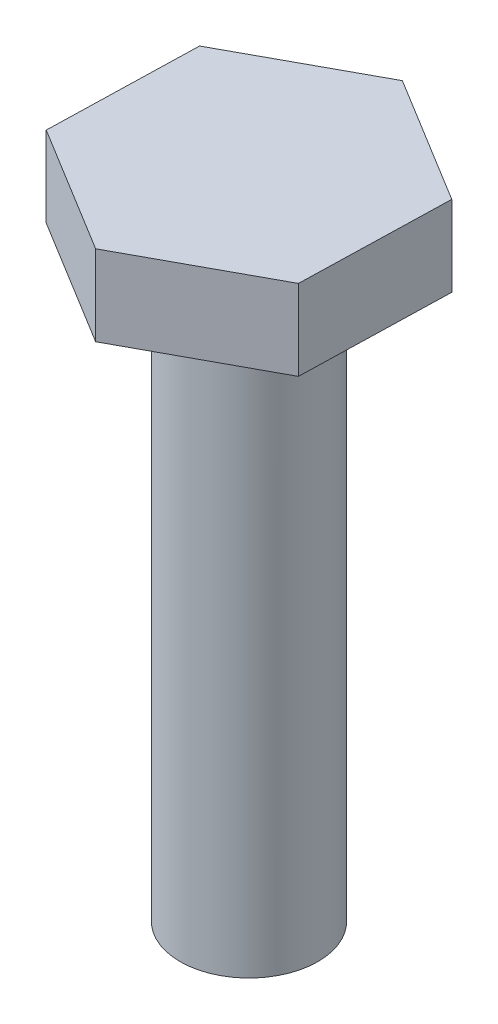
ISO-10303-21;
HEADER;
FILE_DESCRIPTION(('STEP AP214'),'2;1');
FILE_NAME('part.step','',(''),(''),'','','');
FILE_SCHEMA(('AUTOMOTIVE_DESIGN { 1 0 10303 214 1 1 1 1 }'));
ENDSEC;
DATA;
#1=APPLICATION_CONTEXT('core data for automotive mechanical design processes');
#2=APPLICATION_PROTOCOL_DEFINITION('international standard','automotive_design',2000,#1);
#3=PRODUCT_CONTEXT('',#1,'mechanical');
#4=PRODUCT('Part','Part','',(#3));
#5=PRODUCT_RELATED_PRODUCT_CATEGORY('part','',(#4));
#6=PRODUCT_DEFINITION_FORMATION('','',#4);
#7=PRODUCT_DEFINITION_CONTEXT('part definition',#1,'design');
#8=PRODUCT_DEFINITION('design','',#6,#7);
#9=PRODUCT_DEFINITION_SHAPE('','',#8);
#10=(LENGTH_UNIT() NAMED_UNIT(*) SI_UNIT(.MILLI.,.METRE.));
#11=(NAMED_UNIT(*) PLANE_ANGLE_UNIT() SI_UNIT($,.RADIAN.));
#12=(NAMED_UNIT(*) SI_UNIT($,.STERADIAN.) SOLID_ANGLE_UNIT());
#13=UNCERTAINTY_MEASURE_WITH_UNIT(LENGTH_MEASURE(1.E-05),#10,'distance_accuracy_value','');
#14=(GEOMETRIC_REPRESENTATION_CONTEXT(3) GLOBAL_UNCERTAINTY_ASSIGNED_CONTEXT((#13)) GLOBAL_UNIT_ASSIGNED_CONTEXT((#10,
#11,#12)) REPRESENTATION_CONTEXT('',''));
#15=CARTESIAN_POINT('',(0.,0.,0.));
#16=DIRECTION('',(0.,0.,1.));
#17=DIRECTION('',(1.,0.,0.));
#18=AXIS2_PLACEMENT_3D('',#15,#16,#17);
#19=CARTESIAN_POINT('',(-0.167873016872767,3.5,6.49783184225368));
#20=DIRECTION('',(-0.477466711370013,0.,-0.878649838976543));
#21=DIRECTION('',(-0.878649838976543,0.,0.477466711370013));
#22=AXIS2_PLACEMENT_3D('',#19,#20,#21);
#23=PLANE('',#22);
#24=DIRECTION('',(0.878649838976543,0.,-0.477466711370013));
#25=VECTOR('',#24,1.);
#26=CARTESIAN_POINT('',(-0.167873016872767,0.,6.49783184225368));
#27=LINE('',#26,#25);
#28=CARTESIAN_POINT('',(-0.167873016872767,0.,6.49783184225368));
#29=VERTEX_POINT('',#28);
#30=CARTESIAN_POINT('',(5.54335093647476,0.,3.3942982183486));
#31=VERTEX_POINT('',#30);
#32=EDGE_CURVE('E118',#29,#31,#27,.T.);
#33=ORIENTED_EDGE('',*,*,#32,.T.);
#34=DIRECTION('',(0.,-1.,0.));
#35=VECTOR('',#34,1.);
#36=CARTESIAN_POINT('',(5.54335093647476,3.5,3.3942982183486));
#37=LINE('',#36,#35);
#38=CARTESIAN_POINT('',(5.54335093647476,3.5,3.3942982183486));
#39=VERTEX_POINT('',#38);
#40=EDGE_CURVE('E41',#39,#31,#37,.T.);
#41=ORIENTED_EDGE('',*,*,#40,.F.);
#42=DIRECTION('',(0.878649838976543,0.,-0.477466711370013));
#43=VECTOR('',#42,1.);
#44=CARTESIAN_POINT('',(-0.167873016872767,3.5,6.49783184225368));
#45=LINE('',#44,#43);
#46=CARTESIAN_POINT('',(-0.167873016872767,3.5,6.49783184225368));
#47=VERTEX_POINT('',#46);
#48=EDGE_CURVE('E129',#47,#39,#45,.T.);
#49=ORIENTED_EDGE('',*,*,#48,.F.);
#50=DIRECTION('',(0.,-1.,0.));
#51=VECTOR('',#50,1.);
#52=CARTESIAN_POINT('',(-0.167873016872767,3.5,6.49783184225368));
#53=LINE('',#52,#51);
#54=EDGE_CURVE('E114',#47,#29,#53,.T.);
#55=ORIENTED_EDGE('',*,*,#54,.T.);
#56=EDGE_LOOP('',(#33,#41,#49,#55));
#57=FACE_BOUND('',#56,.T.);
#58=ADVANCED_FACE('F33',(#57),#23,.F.);
#59=CARTESIAN_POINT('',(5.54335093647476,3.5,3.3942982183486));
#60=DIRECTION('',(-0.999666437269799,0.,-0.0258266179804261));
#61=DIRECTION('',(-0.0258266179804261,0.,0.999666437269799));
#62=AXIS2_PLACEMENT_3D('',#59,#60,#61);
#63=PLANE('',#62);
#64=DIRECTION('',(0.0258266179804261,0.,-0.999666437269799));
#65=VECTOR('',#64,1.);
#66=CARTESIAN_POINT('',(5.54335093647476,0.,3.3942982183486));
#67=LINE('',#66,#65);
#68=CARTESIAN_POINT('',(5.71122395334753,0.,-3.10353362390509));
#69=VERTEX_POINT('',#68);
#70=EDGE_CURVE('E121',#31,#69,#67,.T.);
#71=ORIENTED_EDGE('',*,*,#70,.T.);
#72=DIRECTION('',(0.,-1.,0.));
#73=VECTOR('',#72,1.);
#74=CARTESIAN_POINT('',(5.71122395334753,3.5,-3.10353362390509));
#75=LINE('',#74,#73);
#76=CARTESIAN_POINT('',(5.71122395334753,3.5,-3.10353362390509));
#77=VERTEX_POINT('',#76);
#78=EDGE_CURVE('E133',#77,#69,#75,.T.);
#79=ORIENTED_EDGE('',*,*,#78,.F.);
#80=DIRECTION('',(0.0258266179804261,0.,-0.999666437269799));
#81=VECTOR('',#80,1.);
#82=CARTESIAN_POINT('',(5.54335093647476,3.5,3.3942982183486));
#83=LINE('',#82,#81);
#84=EDGE_CURVE('E87',#39,#77,#83,.T.);
#85=ORIENTED_EDGE('',*,*,#84,.F.);
#86=ORIENTED_EDGE('',*,*,#40,.T.);
#87=EDGE_LOOP('',(#71,#79,#85,#86));
#88=FACE_BOUND('',#87,.T.);
#89=ADVANCED_FACE('F136',(#88),#63,.F.);
#90=CARTESIAN_POINT('',(5.71122395334753,3.5,-3.10353362390509));
#91=DIRECTION('',(-0.522199725899786,0.,0.852823220996115));
#92=DIRECTION('',(0.852823220996115,0.,0.522199725899786));
#93=AXIS2_PLACEMENT_3D('',#90,#91,#92);
#94=PLANE('',#93);
#95=DIRECTION('',(-0.852823220996115,0.,-0.522199725899786));
#96=VECTOR('',#95,1.);
#97=CARTESIAN_POINT('',(5.71122395334753,0.,-3.10353362390509));
#98=LINE('',#97,#96);
#99=CARTESIAN_POINT('',(0.167873016872779,0.,-6.49783184225369));
#100=VERTEX_POINT('',#99);
#101=EDGE_CURVE('E124',#69,#100,#98,.T.);
#102=ORIENTED_EDGE('',*,*,#101,.T.);
#103=DIRECTION('',(0.,-1.,0.));
#104=VECTOR('',#103,1.);
#105=CARTESIAN_POINT('',(0.167873016872779,3.5,-6.49783184225369));
#106=LINE('',#105,#104);
#107=CARTESIAN_POINT('',(0.167873016872779,3.5,-6.49783184225369));
#108=VERTEX_POINT('',#107);
#109=EDGE_CURVE('E109',#108,#100,#106,.T.);
#110=ORIENTED_EDGE('',*,*,#109,.F.);
#111=DIRECTION('',(-0.852823220996115,0.,-0.522199725899786));
#112=VECTOR('',#111,1.);
#113=CARTESIAN_POINT('',(5.71122395334753,3.5,-3.10353362390509));
#114=LINE('',#113,#112);
#115=EDGE_CURVE('E100',#77,#108,#114,.T.);
#116=ORIENTED_EDGE('',*,*,#115,.F.);
#117=ORIENTED_EDGE('',*,*,#78,.T.);
#118=EDGE_LOOP('',(#102,#110,#116,#117));
#119=FACE_BOUND('',#118,.T.);
#120=ADVANCED_FACE('F144',(#119),#94,.F.);
#121=CARTESIAN_POINT('',(0.167873016872779,3.5,-6.49783184225369));
#122=DIRECTION('',(0.477466711370013,0.,0.878649838976543));
#123=DIRECTION('',(0.878649838976543,0.,-0.477466711370013));
#124=AXIS2_PLACEMENT_3D('',#121,#122,#123);
#125=PLANE('',#124);
#126=DIRECTION('',(-0.878649838976543,0.,0.477466711370013));
#127=VECTOR('',#126,1.);
#128=CARTESIAN_POINT('',(0.167873016872779,0.,-6.49783184225369));
#129=LINE('',#128,#127);
#130=CARTESIAN_POINT('',(-5.54335093647474,0.,-3.39429821834861));
#131=VERTEX_POINT('',#130);
#132=EDGE_CURVE('E108',#100,#131,#129,.T.);
#133=ORIENTED_EDGE('',*,*,#132,.T.);
#134=DIRECTION('',(0.,-1.,0.));
#135=VECTOR('',#134,1.);
#136=CARTESIAN_POINT('',(-5.54335093647474,3.5,-3.39429821834861));
#137=LINE('',#136,#135);
#138=CARTESIAN_POINT('',(-5.54335093647474,3.5,-3.39429821834861));
#139=VERTEX_POINT('',#138);
#140=EDGE_CURVE('E105',#139,#131,#137,.T.);
#141=ORIENTED_EDGE('',*,*,#140,.F.);
#142=DIRECTION('',(-0.878649838976543,0.,0.477466711370013));
#143=VECTOR('',#142,1.);
#144=CARTESIAN_POINT('',(0.167873016872779,3.5,-6.49783184225369));
#145=LINE('',#144,#143);
#146=EDGE_CURVE('E94',#108,#139,#145,.T.);
#147=ORIENTED_EDGE('',*,*,#146,.F.);
#148=ORIENTED_EDGE('',*,*,#109,.T.);
#149=EDGE_LOOP('',(#133,#141,#147,#148));
#150=FACE_BOUND('',#149,.T.);
#151=ADVANCED_FACE('F106',(#150),#125,.F.);
#152=CARTESIAN_POINT('',(-5.54335093647474,3.5,-3.39429821834861));
#153=DIRECTION('',(0.999666437269799,0.,0.0258266179804277));
#154=DIRECTION('',(0.0258266179804277,0.,-0.999666437269799));
#155=AXIS2_PLACEMENT_3D('',#152,#153,#154);
#156=PLANE('',#155);
#157=DIRECTION('',(-0.0258266179804277,0.,0.999666437269799));
#158=VECTOR('',#157,1.);
#159=CARTESIAN_POINT('',(-5.54335093647474,0.,-3.39429821834861));
#160=LINE('',#159,#158);
#161=CARTESIAN_POINT('',(-5.71122395334752,0.,3.10353362390507));
#162=VERTEX_POINT('',#161);
#163=EDGE_CURVE('E72',#131,#162,#160,.T.);
#164=ORIENTED_EDGE('',*,*,#163,.T.);
#165=DIRECTION('',(0.,-1.,0.));
#166=VECTOR('',#165,1.);
#167=CARTESIAN_POINT('',(-5.71122395334752,3.5,3.10353362390507));
#168=LINE('',#167,#166);
#169=CARTESIAN_POINT('',(-5.71122395334752,3.5,3.10353362390507));
#170=VERTEX_POINT('',#169);
#171=EDGE_CURVE('E110',#170,#162,#168,.T.);
#172=ORIENTED_EDGE('',*,*,#171,.F.);
#173=DIRECTION('',(-0.0258266179804277,0.,0.999666437269799));
#174=VECTOR('',#173,1.);
#175=CARTESIAN_POINT('',(-5.54335093647474,3.5,-3.39429821834861));
#176=LINE('',#175,#174);
#177=EDGE_CURVE('E98',#139,#170,#176,.T.);
#178=ORIENTED_EDGE('',*,*,#177,.F.);
#179=ORIENTED_EDGE('',*,*,#140,.T.);
#180=EDGE_LOOP('',(#164,#172,#178,#179));
#181=FACE_BOUND('',#180,.T.);
#182=ADVANCED_FACE('F112',(#181),#156,.F.);
#183=CARTESIAN_POINT('',(-5.71122395334752,3.5,3.10353362390507));
#184=DIRECTION('',(0.522199725899786,0.,-0.852823220996115));
#185=DIRECTION('',(-0.852823220996115,0.,-0.522199725899786));
#186=AXIS2_PLACEMENT_3D('',#183,#184,#185);
#187=PLANE('',#186);
#188=DIRECTION('',(0.852823220996115,0.,0.522199725899786));
#189=VECTOR('',#188,1.);
#190=CARTESIAN_POINT('',(-5.71122395334752,0.,3.10353362390507));
#191=LINE('',#190,#189);
#192=EDGE_CURVE('E78',#162,#29,#191,.T.);
#193=ORIENTED_EDGE('',*,*,#192,.T.);
#194=ORIENTED_EDGE('',*,*,#54,.F.);
#195=DIRECTION('',(0.852823220996115,0.,0.522199725899786));
#196=VECTOR('',#195,1.);
#197=CARTESIAN_POINT('',(-5.71122395334752,3.5,3.10353362390507));
#198=LINE('',#197,#196);
#199=EDGE_CURVE('E49',#170,#47,#198,.T.);
#200=ORIENTED_EDGE('',*,*,#199,.F.);
#201=ORIENTED_EDGE('',*,*,#171,.T.);
#202=EDGE_LOOP('',(#193,#194,#200,#201));
#203=FACE_BOUND('',#202,.T.);
#204=ADVANCED_FACE('F166',(#203),#187,.F.);
#205=CARTESIAN_POINT('',(0.,3.5,0.));
#206=DIRECTION('',(0.,1.,0.));
#207=DIRECTION('',(0.,0.,1.));
#208=AXIS2_PLACEMENT_3D('',#205,#206,#207);
#209=PLANE('',#208);
#210=ORIENTED_EDGE('',*,*,#48,.T.);
#211=ORIENTED_EDGE('',*,*,#84,.T.);
#212=ORIENTED_EDGE('',*,*,#115,.T.);
#213=ORIENTED_EDGE('',*,*,#146,.T.);
#214=ORIENTED_EDGE('',*,*,#177,.T.);
#215=ORIENTED_EDGE('',*,*,#199,.T.);
#216=EDGE_LOOP('',(#210,#211,#212,#213,#214,#215));
#217=FACE_BOUND('',#216,.T.);
#218=ADVANCED_FACE('F96',(#217),#209,.T.);
#219=CARTESIAN_POINT('',(0.,0.,0.));
#220=DIRECTION('',(0.,1.,0.));
#221=DIRECTION('',(0.,0.,1.));
#222=AXIS2_PLACEMENT_3D('',#219,#220,#221);
#223=PLANE('',#222);
#224=CARTESIAN_POINT('',(0.,0.,0.));
#225=DIRECTION('',(0.,1.,0.));
#226=DIRECTION('',(0.,0.,1.));
#227=AXIS2_PLACEMENT_3D('',#224,#225,#226);
#228=CIRCLE('',#227,3.);
#229=CARTESIAN_POINT('',(0.,0.,3.));
#230=VERTEX_POINT('',#229);
#231=EDGE_CURVE('E11',#230,#230,#228,.F.);
#232=ORIENTED_EDGE('',*,*,#231,.F.);
#233=EDGE_LOOP('',(#232));
#234=FACE_BOUND('',#233,.T.);
#235=ORIENTED_EDGE('',*,*,#32,.F.);
#236=ORIENTED_EDGE('',*,*,#192,.F.);
#237=ORIENTED_EDGE('',*,*,#163,.F.);
#238=ORIENTED_EDGE('',*,*,#132,.F.);
#239=ORIENTED_EDGE('',*,*,#101,.F.);
#240=ORIENTED_EDGE('',*,*,#70,.F.);
#241=EDGE_LOOP('',(#235,#236,#237,#238,#239,#240));
#242=FACE_BOUND('',#241,.T.);
#243=ADVANCED_FACE('F141',(#234,#242),#223,.F.);
#244=CARTESIAN_POINT('',(0.,-25.,0.));
#245=DIRECTION('',(0.,1.,0.));
#246=DIRECTION('',(0.,0.,1.));
#247=AXIS2_PLACEMENT_3D('',#244,#245,#246);
#248=CYLINDRICAL_SURFACE('',#247,3.);
#249=CARTESIAN_POINT('',(0.,-25.,0.));
#250=DIRECTION('',(0.,-1.,0.));
#251=DIRECTION('',(0.,0.,-1.));
#252=AXIS2_PLACEMENT_3D('',#249,#250,#251);
#253=CIRCLE('',#252,3.);
#254=CARTESIAN_POINT('',(0.,-25.,-3.));
#255=VERTEX_POINT('',#254);
#256=EDGE_CURVE('E122',#255,#255,#253,.T.);
#257=ORIENTED_EDGE('',*,*,#256,.F.);
#258=EDGE_LOOP('',(#257));
#259=FACE_BOUND('',#258,.T.);
#260=ORIENTED_EDGE('',*,*,#231,.T.);
#261=EDGE_LOOP('',(#260));
#262=FACE_BOUND('',#261,.T.);
#263=ADVANCED_FACE('F153',(#259,#262),#248,.T.);
#264=CARTESIAN_POINT('',(0.,-25.,0.));
#265=DIRECTION('',(0.,-1.,0.));
#266=DIRECTION('',(0.,0.,-1.));
#267=AXIS2_PLACEMENT_3D('',#264,#265,#266);
#268=PLANE('',#267);
#269=ORIENTED_EDGE('',*,*,#256,.T.);
#270=EDGE_LOOP('',(#269));
#271=FACE_BOUND('',#270,.T.);
#272=ADVANCED_FACE('F151',(#271),#268,.T.);
#273=CLOSED_SHELL('',(#58,#89,#120,#151,#182,#204,#218,#243,#263,#272));
#274=MANIFOLD_SOLID_BREP('B2',#273);
#275=ADVANCED_BREP_SHAPE_REPRESENTATION('',(#18,#274),#14);
#276=SHAPE_DEFINITION_REPRESENTATION(#9,#275);
ENDSEC;
END-ISO-10303-21;
